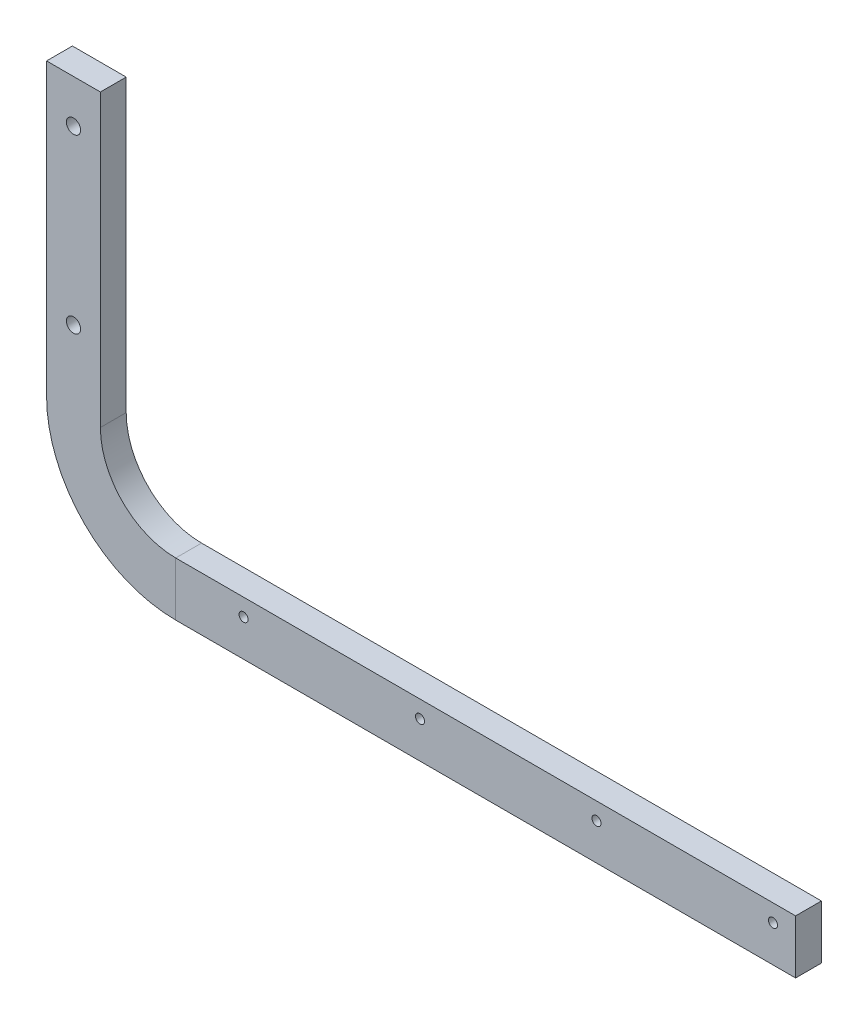
ISO-10303-21;
HEADER;
FILE_DESCRIPTION(('STEP AP214'),'2;1');
FILE_NAME('part.step','',(''),(''),'','','');
FILE_SCHEMA(('AUTOMOTIVE_DESIGN { 1 0 10303 214 1 1 1 1 }'));
ENDSEC;
DATA;
#1=APPLICATION_CONTEXT('core data for automotive mechanical design processes');
#2=APPLICATION_PROTOCOL_DEFINITION('international standard','automotive_design',2000,#1);
#3=PRODUCT_CONTEXT('',#1,'mechanical');
#4=PRODUCT('Part','Part','',(#3));
#5=PRODUCT_RELATED_PRODUCT_CATEGORY('part','',(#4));
#6=PRODUCT_DEFINITION_FORMATION('','',#4);
#7=PRODUCT_DEFINITION_CONTEXT('part definition',#1,'design');
#8=PRODUCT_DEFINITION('design','',#6,#7);
#9=PRODUCT_DEFINITION_SHAPE('','',#8);
#10=(LENGTH_UNIT() NAMED_UNIT(*) SI_UNIT(.MILLI.,.METRE.));
#11=(NAMED_UNIT(*) PLANE_ANGLE_UNIT() SI_UNIT($,.RADIAN.));
#12=(NAMED_UNIT(*) SI_UNIT($,.STERADIAN.) SOLID_ANGLE_UNIT());
#13=UNCERTAINTY_MEASURE_WITH_UNIT(LENGTH_MEASURE(1.E-05),#10,'distance_accuracy_value','');
#14=(GEOMETRIC_REPRESENTATION_CONTEXT(3) GLOBAL_UNCERTAINTY_ASSIGNED_CONTEXT((#13)) GLOBAL_UNIT_ASSIGNED_CONTEXT((#10,
#11,#12)) REPRESENTATION_CONTEXT('',''));
#15=CARTESIAN_POINT('',(0.,0.,0.));
#16=DIRECTION('',(0.,0.,1.));
#17=DIRECTION('',(1.,0.,0.));
#18=AXIS2_PLACEMENT_3D('',#15,#16,#17);
#19=CARTESIAN_POINT('',(91.4999999999995,-178.,6.));
#20=DIRECTION('',(0.,0.,1.));
#21=DIRECTION('',(1.,0.,0.));
#22=AXIS2_PLACEMENT_3D('',#19,#20,#21);
#23=CYLINDRICAL_SURFACE('',#22,2.09999999999999);
#24=CARTESIAN_POINT('',(91.4999999999995,-178.,-6.));
#25=DIRECTION('',(0.,0.,1.));
#26=DIRECTION('',(1.,0.,0.));
#27=AXIS2_PLACEMENT_3D('',#24,#25,#26);
#28=CIRCLE('',#27,2.09999999999999);
#29=CARTESIAN_POINT('',(93.5999999999995,-178.,-6.));
#30=VERTEX_POINT('',#29);
#31=EDGE_CURVE('E51',#30,#30,#28,.T.);
#32=ORIENTED_EDGE('',*,*,#31,.F.);
#33=EDGE_LOOP('',(#32));
#34=FACE_BOUND('',#33,.T.);
#35=CARTESIAN_POINT('',(91.4999999999995,-178.,6.));
#36=DIRECTION('',(0.,0.,1.));
#37=DIRECTION('',(1.,0.,0.));
#38=AXIS2_PLACEMENT_3D('',#35,#36,#37);
#39=CIRCLE('',#38,2.09999999999999);
#40=CARTESIAN_POINT('',(93.5999999999995,-178.,6.));
#41=VERTEX_POINT('',#40);
#42=EDGE_CURVE('E11',#41,#41,#39,.T.);
#43=ORIENTED_EDGE('',*,*,#42,.T.);
#44=EDGE_LOOP('',(#43));
#45=FACE_BOUND('',#44,.T.);
#46=ADVANCED_FACE('F44',(#34,#45),#23,.F.);
#47=CARTESIAN_POINT('',(173.499999999999,-178.,6.));
#48=DIRECTION('',(0.,0.,1.));
#49=DIRECTION('',(1.,0.,0.));
#50=AXIS2_PLACEMENT_3D('',#47,#48,#49);
#51=CYLINDRICAL_SURFACE('',#50,2.09999999999999);
#52=CARTESIAN_POINT('',(173.499999999999,-178.,-6.));
#53=DIRECTION('',(0.,0.,1.));
#54=DIRECTION('',(1.,0.,0.));
#55=AXIS2_PLACEMENT_3D('',#52,#53,#54);
#56=CIRCLE('',#55,2.09999999999999);
#57=CARTESIAN_POINT('',(175.599999999999,-178.,-6.));
#58=VERTEX_POINT('',#57);
#59=EDGE_CURVE('E149',#58,#58,#56,.T.);
#60=ORIENTED_EDGE('',*,*,#59,.F.);
#61=EDGE_LOOP('',(#60));
#62=FACE_BOUND('',#61,.T.);
#63=CARTESIAN_POINT('',(173.499999999999,-178.,6.));
#64=DIRECTION('',(0.,0.,1.));
#65=DIRECTION('',(1.,0.,0.));
#66=AXIS2_PLACEMENT_3D('',#63,#64,#65);
#67=CIRCLE('',#66,2.09999999999999);
#68=CARTESIAN_POINT('',(175.599999999999,-178.,6.));
#69=VERTEX_POINT('',#68);
#70=EDGE_CURVE('E152',#69,#69,#67,.T.);
#71=ORIENTED_EDGE('',*,*,#70,.T.);
#72=EDGE_LOOP('',(#71));
#73=FACE_BOUND('',#72,.T.);
#74=ADVANCED_FACE('F161',(#62,#73),#51,.F.);
#75=CARTESIAN_POINT('',(60.,-135.,6.));
#76=DIRECTION('',(0.,0.,1.));
#77=DIRECTION('',(1.,0.,0.));
#78=AXIS2_PLACEMENT_3D('',#75,#76,#77);
#79=PLANE('',#78);
#80=CARTESIAN_POINT('',(12.5,-20.0000000000001,6.));
#81=DIRECTION('',(0.,0.,1.));
#82=DIRECTION('',(1.,0.,0.));
#83=AXIS2_PLACEMENT_3D('',#80,#81,#82);
#84=CIRCLE('',#83,3.3);
#85=CARTESIAN_POINT('',(15.8,-20.0000000000001,6.));
#86=VERTEX_POINT('',#85);
#87=EDGE_CURVE('E194',#86,#86,#84,.T.);
#88=ORIENTED_EDGE('',*,*,#87,.F.);
#89=EDGE_LOOP('',(#88));
#90=FACE_BOUND('',#89,.T.);
#91=CARTESIAN_POINT('',(12.4999999999993,-100.,6.));
#92=DIRECTION('',(0.,0.,1.));
#93=DIRECTION('',(1.,0.,0.));
#94=AXIS2_PLACEMENT_3D('',#91,#92,#93);
#95=CIRCLE('',#94,3.3);
#96=CARTESIAN_POINT('',(15.7999999999993,-100.,6.));
#97=VERTEX_POINT('',#96);
#98=EDGE_CURVE('E197',#97,#97,#95,.T.);
#99=ORIENTED_EDGE('',*,*,#98,.F.);
#100=EDGE_LOOP('',(#99));
#101=FACE_BOUND('',#100,.T.);
#102=CARTESIAN_POINT('',(60.,-135.,6.));
#103=DIRECTION('',(0.,0.,1.));
#104=DIRECTION('',(1.,0.,0.));
#105=AXIS2_PLACEMENT_3D('',#102,#103,#104);
#106=CIRCLE('',#105,60.);
#107=CARTESIAN_POINT('',(0.,-135.,6.));
#108=VERTEX_POINT('',#107);
#109=CARTESIAN_POINT('',(60.,-195.,6.));
#110=VERTEX_POINT('',#109);
#111=EDGE_CURVE('E124',#108,#110,#106,.T.);
#112=ORIENTED_EDGE('',*,*,#111,.T.);
#113=DIRECTION('',(0.,1.,0.));
#114=VECTOR('',#113,1.);
#115=CARTESIAN_POINT('',(60.,-135.,6.));
#116=LINE('',#115,#114);
#117=CARTESIAN_POINT('',(60.,-170.,6.));
#118=VERTEX_POINT('',#117);
#119=EDGE_CURVE('E141',#110,#118,#116,.T.);
#120=ORIENTED_EDGE('',*,*,#119,.T.);
#121=CARTESIAN_POINT('',(60.,-135.,6.));
#122=DIRECTION('',(0.,0.,-1.));
#123=DIRECTION('',(-1.,0.,0.));
#124=AXIS2_PLACEMENT_3D('',#121,#122,#123);
#125=CIRCLE('',#124,35.);
#126=CARTESIAN_POINT('',(25.,-135.,6.));
#127=VERTEX_POINT('',#126);
#128=EDGE_CURVE('E216',#118,#127,#125,.T.);
#129=ORIENTED_EDGE('',*,*,#128,.T.);
#130=DIRECTION('',(0.,1.,0.));
#131=VECTOR('',#130,1.);
#132=CARTESIAN_POINT('',(25.,-135.,6.));
#133=LINE('',#132,#131);
#134=CARTESIAN_POINT('',(25.,0.,6.));
#135=VERTEX_POINT('',#134);
#136=EDGE_CURVE('E130',#127,#135,#133,.T.);
#137=ORIENTED_EDGE('',*,*,#136,.T.);
#138=DIRECTION('',(-1.,0.,0.));
#139=VECTOR('',#138,1.);
#140=CARTESIAN_POINT('',(25.,0.,6.));
#141=LINE('',#140,#139);
#142=CARTESIAN_POINT('',(0.,0.,6.));
#143=VERTEX_POINT('',#142);
#144=EDGE_CURVE('E125',#135,#143,#141,.T.);
#145=ORIENTED_EDGE('',*,*,#144,.T.);
#146=DIRECTION('',(0.,-1.,0.));
#147=VECTOR('',#146,1.);
#148=CARTESIAN_POINT('',(0.,0.,6.));
#149=LINE('',#148,#147);
#150=EDGE_CURVE('E112',#143,#108,#149,.T.);
#151=ORIENTED_EDGE('',*,*,#150,.T.);
#152=EDGE_LOOP('',(#112,#120,#129,#137,#145,#151));
#153=FACE_BOUND('',#152,.T.);
#154=ADVANCED_FACE('F128',(#90,#101,#153),#79,.T.);
#155=CARTESIAN_POINT('',(60.,-135.,-6.));
#156=DIRECTION('',(0.,0.,1.));
#157=DIRECTION('',(1.,0.,0.));
#158=AXIS2_PLACEMENT_3D('',#155,#156,#157);
#159=PLANE('',#158);
#160=CARTESIAN_POINT('',(255.499999999999,-178.,-6.));
#161=DIRECTION('',(0.,0.,1.));
#162=DIRECTION('',(1.,0.,0.));
#163=AXIS2_PLACEMENT_3D('',#160,#161,#162);
#164=CIRCLE('',#163,2.09999999999999);
#165=CARTESIAN_POINT('',(257.599999999999,-178.,-6.));
#166=VERTEX_POINT('',#165);
#167=EDGE_CURVE('E507',#166,#166,#164,.T.);
#168=ORIENTED_EDGE('',*,*,#167,.T.);
#169=EDGE_LOOP('',(#168));
#170=FACE_BOUND('',#169,.T.);
#171=CARTESIAN_POINT('',(337.499999999999,-178.,-6.));
#172=DIRECTION('',(0.,0.,1.));
#173=DIRECTION('',(1.,0.,0.));
#174=AXIS2_PLACEMENT_3D('',#171,#172,#173);
#175=CIRCLE('',#174,2.09999999999999);
#176=CARTESIAN_POINT('',(339.599999999999,-178.,-6.));
#177=VERTEX_POINT('',#176);
#178=EDGE_CURVE('E513',#177,#177,#175,.T.);
#179=ORIENTED_EDGE('',*,*,#178,.T.);
#180=EDGE_LOOP('',(#179));
#181=FACE_BOUND('',#180,.T.);
#182=DIRECTION('',(-1.,0.,0.));
#183=VECTOR('',#182,1.);
#184=CARTESIAN_POINT('',(60.,-116.604888099516,-6.));
#185=LINE('',#184,#183);
#186=CARTESIAN_POINT('',(25.,-116.604888099516,-6.));
#187=VERTEX_POINT('',#186);
#188=CARTESIAN_POINT('',(0.,-116.604888099516,-6.));
#189=VERTEX_POINT('',#188);
#190=EDGE_CURVE('E58',#187,#189,#185,.T.);
#191=ORIENTED_EDGE('',*,*,#190,.F.);
#192=DIRECTION('',(0.,1.,0.));
#193=VECTOR('',#192,1.);
#194=CARTESIAN_POINT('',(25.,-135.,-6.));
#195=LINE('',#194,#193);
#196=CARTESIAN_POINT('',(25.,-135.,-6.));
#197=VERTEX_POINT('',#196);
#198=EDGE_CURVE('E134',#197,#187,#195,.T.);
#199=ORIENTED_EDGE('',*,*,#198,.F.);
#200=CARTESIAN_POINT('',(60.,-135.,-6.));
#201=DIRECTION('',(0.,0.,-1.));
#202=DIRECTION('',(-1.,0.,0.));
#203=AXIS2_PLACEMENT_3D('',#200,#201,#202);
#204=CIRCLE('',#203,35.);
#205=CARTESIAN_POINT('',(60.,-170.,-6.));
#206=VERTEX_POINT('',#205);
#207=EDGE_CURVE('E232',#206,#197,#204,.T.);
#208=ORIENTED_EDGE('',*,*,#207,.F.);
#209=DIRECTION('',(-1.,0.,0.));
#210=VECTOR('',#209,1.);
#211=CARTESIAN_POINT('',(348.,-170.,-6.));
#212=LINE('',#211,#210);
#213=CARTESIAN_POINT('',(348.,-170.,-6.));
#214=VERTEX_POINT('',#213);
#215=EDGE_CURVE('E230',#214,#206,#212,.T.);
#216=ORIENTED_EDGE('',*,*,#215,.F.);
#217=DIRECTION('',(0.,1.,0.));
#218=VECTOR('',#217,1.);
#219=CARTESIAN_POINT('',(348.,-195.,-6.));
#220=LINE('',#219,#218);
#221=CARTESIAN_POINT('',(348.,-195.,-6.));
#222=VERTEX_POINT('',#221);
#223=EDGE_CURVE('E228',#222,#214,#220,.T.);
#224=ORIENTED_EDGE('',*,*,#223,.F.);
#225=DIRECTION('',(1.,0.,0.));
#226=VECTOR('',#225,1.);
#227=CARTESIAN_POINT('',(60.,-195.,-6.));
#228=LINE('',#227,#226);
#229=CARTESIAN_POINT('',(60.,-195.,-6.));
#230=VERTEX_POINT('',#229);
#231=EDGE_CURVE('E226',#230,#222,#228,.T.);
#232=ORIENTED_EDGE('',*,*,#231,.F.);
#233=CARTESIAN_POINT('',(60.,-135.,-6.));
#234=DIRECTION('',(0.,0.,1.));
#235=DIRECTION('',(1.,0.,0.));
#236=AXIS2_PLACEMENT_3D('',#233,#234,#235);
#237=CIRCLE('',#236,60.);
#238=CARTESIAN_POINT('',(0.,-135.,-6.));
#239=VERTEX_POINT('',#238);
#240=EDGE_CURVE('E224',#239,#230,#237,.T.);
#241=ORIENTED_EDGE('',*,*,#240,.F.);
#242=DIRECTION('',(0.,-1.,0.));
#243=VECTOR('',#242,1.);
#244=CARTESIAN_POINT('',(0.,0.,-6.));
#245=LINE('',#244,#243);
#246=EDGE_CURVE('E221',#189,#239,#245,.T.);
#247=ORIENTED_EDGE('',*,*,#246,.F.);
#248=EDGE_LOOP('',(#191,#199,#208,#216,#224,#232,#241,#247));
#249=FACE_BOUND('',#248,.T.);
#250=ORIENTED_EDGE('',*,*,#59,.T.);
#251=EDGE_LOOP('',(#250));
#252=FACE_BOUND('',#251,.T.);
#253=ORIENTED_EDGE('',*,*,#31,.T.);
#254=EDGE_LOOP('',(#253));
#255=FACE_BOUND('',#254,.T.);
#256=ADVANCED_FACE('F157',(#170,#181,#249,#252,#255),#159,.F.);
#257=CARTESIAN_POINT('',(25.,0.,6.));
#258=DIRECTION('',(0.,-1.,0.));
#259=DIRECTION('',(1.,0.,0.));
#260=AXIS2_PLACEMENT_3D('',#257,#258,#259);
#261=PLANE('',#260);
#262=DIRECTION('',(-1.,0.,0.));
#263=VECTOR('',#262,1.);
#264=CARTESIAN_POINT('',(25.,0.,-6.));
#265=LINE('',#264,#263);
#266=CARTESIAN_POINT('',(25.,0.,-6.));
#267=VERTEX_POINT('',#266);
#268=CARTESIAN_POINT('',(0.,0.,-6.));
#269=VERTEX_POINT('',#268);
#270=EDGE_CURVE('E138',#267,#269,#265,.T.);
#271=ORIENTED_EDGE('',*,*,#270,.T.);
#272=DIRECTION('',(0.,0.,-1.));
#273=VECTOR('',#272,1.);
#274=CARTESIAN_POINT('',(0.,0.,6.));
#275=LINE('',#274,#273);
#276=EDGE_CURVE('E117',#143,#269,#275,.T.);
#277=ORIENTED_EDGE('',*,*,#276,.F.);
#278=ORIENTED_EDGE('',*,*,#144,.F.);
#279=DIRECTION('',(0.,0.,-1.));
#280=VECTOR('',#279,1.);
#281=CARTESIAN_POINT('',(25.,0.,6.));
#282=LINE('',#281,#280);
#283=EDGE_CURVE('E219',#135,#267,#282,.T.);
#284=ORIENTED_EDGE('',*,*,#283,.T.);
#285=EDGE_LOOP('',(#271,#277,#278,#284));
#286=FACE_BOUND('',#285,.T.);
#287=ADVANCED_FACE('F136',(#286),#261,.F.);
#288=CARTESIAN_POINT('',(0.,0.,6.));
#289=DIRECTION('',(1.,0.,0.));
#290=DIRECTION('',(0.,1.,0.));
#291=AXIS2_PLACEMENT_3D('',#288,#289,#290);
#292=PLANE('',#291);
#293=EDGE_CURVE('E222',#269,#189,#245,.T.);
#294=ORIENTED_EDGE('',*,*,#293,.T.);
#295=ORIENTED_EDGE('',*,*,#246,.T.);
#296=DIRECTION('',(0.,0.,-1.));
#297=VECTOR('',#296,1.);
#298=CARTESIAN_POINT('',(0.,-135.,6.));
#299=LINE('',#298,#297);
#300=EDGE_CURVE('E120',#108,#239,#299,.T.);
#301=ORIENTED_EDGE('',*,*,#300,.F.);
#302=ORIENTED_EDGE('',*,*,#150,.F.);
#303=ORIENTED_EDGE('',*,*,#276,.T.);
#304=EDGE_LOOP('',(#294,#295,#301,#302,#303));
#305=FACE_BOUND('',#304,.T.);
#306=ADVANCED_FACE('F115',(#305),#292,.F.);
#307=CARTESIAN_POINT('',(60.,-135.,6.));
#308=DIRECTION('',(0.,0.,-1.));
#309=DIRECTION('',(-1.,0.,0.));
#310=AXIS2_PLACEMENT_3D('',#307,#308,#309);
#311=CYLINDRICAL_SURFACE('',#310,60.);
#312=ORIENTED_EDGE('',*,*,#240,.T.);
#313=DIRECTION('',(0.,0.,-1.));
#314=VECTOR('',#313,1.);
#315=CARTESIAN_POINT('',(60.,-195.,6.));
#316=LINE('',#315,#314);
#317=EDGE_CURVE('E143',#110,#230,#316,.T.);
#318=ORIENTED_EDGE('',*,*,#317,.F.);
#319=ORIENTED_EDGE('',*,*,#111,.F.);
#320=ORIENTED_EDGE('',*,*,#300,.T.);
#321=EDGE_LOOP('',(#312,#318,#319,#320));
#322=FACE_BOUND('',#321,.T.);
#323=ADVANCED_FACE('F273',(#322),#311,.T.);
#324=CARTESIAN_POINT('',(60.,-195.,6.));
#325=DIRECTION('',(0.,1.,0.));
#326=DIRECTION('',(0.,0.,1.));
#327=AXIS2_PLACEMENT_3D('',#324,#325,#326);
#328=PLANE('',#327);
#329=ORIENTED_EDGE('',*,*,#231,.T.);
#330=DIRECTION('',(0.,0.,-1.));
#331=VECTOR('',#330,1.);
#332=CARTESIAN_POINT('',(348.,-195.,6.));
#333=LINE('',#332,#331);
#334=CARTESIAN_POINT('',(348.,-195.,6.));
#335=VERTEX_POINT('',#334);
#336=EDGE_CURVE('E247',#335,#222,#333,.T.);
#337=ORIENTED_EDGE('',*,*,#336,.F.);
#338=DIRECTION('',(1.,0.,0.));
#339=VECTOR('',#338,1.);
#340=CARTESIAN_POINT('',(60.,-195.,6.));
#341=LINE('',#340,#339);
#342=EDGE_CURVE('E209',#110,#335,#341,.T.);
#343=ORIENTED_EDGE('',*,*,#342,.F.);
#344=ORIENTED_EDGE('',*,*,#317,.T.);
#345=EDGE_LOOP('',(#329,#337,#343,#344));
#346=FACE_BOUND('',#345,.T.);
#347=ADVANCED_FACE('F254',(#346),#328,.F.);
#348=CARTESIAN_POINT('',(348.,-195.,6.));
#349=DIRECTION('',(-1.,0.,0.));
#350=DIRECTION('',(0.,0.,1.));
#351=AXIS2_PLACEMENT_3D('',#348,#349,#350);
#352=PLANE('',#351);
#353=ORIENTED_EDGE('',*,*,#223,.T.);
#354=DIRECTION('',(0.,0.,-1.));
#355=VECTOR('',#354,1.);
#356=CARTESIAN_POINT('',(348.,-170.,6.));
#357=LINE('',#356,#355);
#358=CARTESIAN_POINT('',(348.,-170.,6.));
#359=VERTEX_POINT('',#358);
#360=EDGE_CURVE('E244',#359,#214,#357,.T.);
#361=ORIENTED_EDGE('',*,*,#360,.F.);
#362=DIRECTION('',(0.,1.,0.));
#363=VECTOR('',#362,1.);
#364=CARTESIAN_POINT('',(348.,-195.,6.));
#365=LINE('',#364,#363);
#366=EDGE_CURVE('E211',#335,#359,#365,.T.);
#367=ORIENTED_EDGE('',*,*,#366,.F.);
#368=ORIENTED_EDGE('',*,*,#336,.T.);
#369=EDGE_LOOP('',(#353,#361,#367,#368));
#370=FACE_BOUND('',#369,.T.);
#371=ADVANCED_FACE('F264',(#370),#352,.F.);
#372=CARTESIAN_POINT('',(348.,-170.,6.));
#373=DIRECTION('',(0.,-1.,0.));
#374=DIRECTION('',(1.,0.,0.));
#375=AXIS2_PLACEMENT_3D('',#372,#373,#374);
#376=PLANE('',#375);
#377=ORIENTED_EDGE('',*,*,#215,.T.);
#378=DIRECTION('',(0.,0.,-1.));
#379=VECTOR('',#378,1.);
#380=CARTESIAN_POINT('',(60.,-170.,6.));
#381=LINE('',#380,#379);
#382=EDGE_CURVE('E241',#118,#206,#381,.T.);
#383=ORIENTED_EDGE('',*,*,#382,.F.);
#384=DIRECTION('',(-1.,0.,0.));
#385=VECTOR('',#384,1.);
#386=CARTESIAN_POINT('',(348.,-170.,6.));
#387=LINE('',#386,#385);
#388=EDGE_CURVE('E213',#359,#118,#387,.T.);
#389=ORIENTED_EDGE('',*,*,#388,.F.);
#390=ORIENTED_EDGE('',*,*,#360,.T.);
#391=EDGE_LOOP('',(#377,#383,#389,#390));
#392=FACE_BOUND('',#391,.T.);
#393=ADVANCED_FACE('F268',(#392),#376,.F.);
#394=CARTESIAN_POINT('',(60.,-135.,6.));
#395=DIRECTION('',(0.,0.,-1.));
#396=DIRECTION('',(-1.,0.,0.));
#397=AXIS2_PLACEMENT_3D('',#394,#395,#396);
#398=CYLINDRICAL_SURFACE('',#397,35.);
#399=ORIENTED_EDGE('',*,*,#207,.T.);
#400=DIRECTION('',(0.,0.,-1.));
#401=VECTOR('',#400,1.);
#402=CARTESIAN_POINT('',(25.,-135.,6.));
#403=LINE('',#402,#401);
#404=EDGE_CURVE('E238',#127,#197,#403,.T.);
#405=ORIENTED_EDGE('',*,*,#404,.F.);
#406=ORIENTED_EDGE('',*,*,#128,.F.);
#407=ORIENTED_EDGE('',*,*,#382,.T.);
#408=EDGE_LOOP('',(#399,#405,#406,#407));
#409=FACE_BOUND('',#408,.T.);
#410=ADVANCED_FACE('F177',(#409),#398,.F.);
#411=CARTESIAN_POINT('',(25.,-135.,6.));
#412=DIRECTION('',(-1.,0.,0.));
#413=DIRECTION('',(0.,0.,1.));
#414=AXIS2_PLACEMENT_3D('',#411,#412,#413);
#415=PLANE('',#414);
#416=ORIENTED_EDGE('',*,*,#198,.T.);
#417=EDGE_CURVE('E234',#187,#267,#195,.T.);
#418=ORIENTED_EDGE('',*,*,#417,.T.);
#419=ORIENTED_EDGE('',*,*,#283,.F.);
#420=ORIENTED_EDGE('',*,*,#136,.F.);
#421=ORIENTED_EDGE('',*,*,#404,.T.);
#422=EDGE_LOOP('',(#416,#418,#419,#420,#421));
#423=FACE_BOUND('',#422,.T.);
#424=ADVANCED_FACE('F167',(#423),#415,.F.);
#425=CARTESIAN_POINT('',(255.499999999999,-178.,6.));
#426=DIRECTION('',(0.,0.,1.));
#427=DIRECTION('',(1.,0.,0.));
#428=AXIS2_PLACEMENT_3D('',#425,#426,#427);
#429=CIRCLE('',#428,2.09999999999999);
#430=CARTESIAN_POINT('',(257.599999999999,-178.,6.));
#431=VERTEX_POINT('',#430);
#432=EDGE_CURVE('E509',#431,#431,#429,.T.);
#433=ORIENTED_EDGE('',*,*,#432,.F.);
#434=EDGE_LOOP('',(#433));
#435=FACE_BOUND('',#434,.T.);
#436=CARTESIAN_POINT('',(337.499999999999,-178.,6.));
#437=DIRECTION('',(0.,0.,1.));
#438=DIRECTION('',(1.,0.,0.));
#439=AXIS2_PLACEMENT_3D('',#436,#437,#438);
#440=CIRCLE('',#439,2.09999999999999);
#441=CARTESIAN_POINT('',(339.599999999999,-178.,6.));
#442=VERTEX_POINT('',#441);
#443=EDGE_CURVE('E510',#442,#442,#440,.T.);
#444=ORIENTED_EDGE('',*,*,#443,.F.);
#445=EDGE_LOOP('',(#444));
#446=FACE_BOUND('',#445,.T.);
#447=ORIENTED_EDGE('',*,*,#119,.F.);
#448=ORIENTED_EDGE('',*,*,#342,.T.);
#449=ORIENTED_EDGE('',*,*,#366,.T.);
#450=ORIENTED_EDGE('',*,*,#388,.T.);
#451=EDGE_LOOP('',(#447,#448,#449,#450));
#452=FACE_BOUND('',#451,.T.);
#453=ORIENTED_EDGE('',*,*,#70,.F.);
#454=EDGE_LOOP('',(#453));
#455=FACE_BOUND('',#454,.T.);
#456=ORIENTED_EDGE('',*,*,#42,.F.);
#457=EDGE_LOOP('',(#456));
#458=FACE_BOUND('',#457,.T.);
#459=ADVANCED_FACE('F164',(#435,#446,#452,#455,#458),#79,.T.);
#460=CARTESIAN_POINT('',(12.5,-20.0000000000001,-6.));
#461=DIRECTION('',(0.,0.,1.));
#462=DIRECTION('',(1.,0.,0.));
#463=AXIS2_PLACEMENT_3D('',#460,#461,#462);
#464=CIRCLE('',#463,3.3);
#465=CARTESIAN_POINT('',(15.8,-20.0000000000001,-6.));
#466=VERTEX_POINT('',#465);
#467=EDGE_CURVE('E200',#466,#466,#464,.T.);
#468=ORIENTED_EDGE('',*,*,#467,.T.);
#469=EDGE_LOOP('',(#468));
#470=FACE_BOUND('',#469,.T.);
#471=CARTESIAN_POINT('',(12.4999999999993,-100.,-6.));
#472=DIRECTION('',(0.,0.,1.));
#473=DIRECTION('',(1.,0.,0.));
#474=AXIS2_PLACEMENT_3D('',#471,#472,#473);
#475=CIRCLE('',#474,3.3);
#476=CARTESIAN_POINT('',(15.7999999999993,-100.,-6.));
#477=VERTEX_POINT('',#476);
#478=EDGE_CURVE('E199',#477,#477,#475,.T.);
#479=ORIENTED_EDGE('',*,*,#478,.T.);
#480=EDGE_LOOP('',(#479));
#481=FACE_BOUND('',#480,.T.);
#482=ORIENTED_EDGE('',*,*,#417,.F.);
#483=ORIENTED_EDGE('',*,*,#190,.T.);
#484=ORIENTED_EDGE('',*,*,#293,.F.);
#485=ORIENTED_EDGE('',*,*,#270,.F.);
#486=EDGE_LOOP('',(#482,#483,#484,#485));
#487=FACE_BOUND('',#486,.T.);
#488=ADVANCED_FACE('F166',(#470,#481,#487),#159,.F.);
#489=CARTESIAN_POINT('',(12.4999999999993,-100.,6.));
#490=DIRECTION('',(0.,0.,1.));
#491=DIRECTION('',(1.,0.,0.));
#492=AXIS2_PLACEMENT_3D('',#489,#490,#491);
#493=CYLINDRICAL_SURFACE('',#492,3.3);
#494=ORIENTED_EDGE('',*,*,#478,.F.);
#495=EDGE_LOOP('',(#494));
#496=FACE_BOUND('',#495,.T.);
#497=ORIENTED_EDGE('',*,*,#98,.T.);
#498=EDGE_LOOP('',(#497));
#499=FACE_BOUND('',#498,.T.);
#500=ADVANCED_FACE('F174',(#496,#499),#493,.F.);
#501=CARTESIAN_POINT('',(12.5,-20.0000000000001,6.));
#502=DIRECTION('',(0.,0.,1.));
#503=DIRECTION('',(1.,0.,0.));
#504=AXIS2_PLACEMENT_3D('',#501,#502,#503);
#505=CYLINDRICAL_SURFACE('',#504,3.3);
#506=ORIENTED_EDGE('',*,*,#467,.F.);
#507=EDGE_LOOP('',(#506));
#508=FACE_BOUND('',#507,.T.);
#509=ORIENTED_EDGE('',*,*,#87,.T.);
#510=EDGE_LOOP('',(#509));
#511=FACE_BOUND('',#510,.T.);
#512=ADVANCED_FACE('F356',(#508,#511),#505,.F.);
#513=CARTESIAN_POINT('',(337.499999999999,-178.,6.));
#514=DIRECTION('',(0.,0.,1.));
#515=DIRECTION('',(1.,0.,0.));
#516=AXIS2_PLACEMENT_3D('',#513,#514,#515);
#517=CYLINDRICAL_SURFACE('',#516,2.09999999999999);
#518=ORIENTED_EDGE('',*,*,#178,.F.);
#519=EDGE_LOOP('',(#518));
#520=FACE_BOUND('',#519,.T.);
#521=ORIENTED_EDGE('',*,*,#443,.T.);
#522=EDGE_LOOP('',(#521));
#523=FACE_BOUND('',#522,.T.);
#524=ADVANCED_FACE('F364',(#520,#523),#517,.F.);
#525=CARTESIAN_POINT('',(255.499999999999,-178.,6.));
#526=DIRECTION('',(0.,0.,1.));
#527=DIRECTION('',(1.,0.,0.));
#528=AXIS2_PLACEMENT_3D('',#525,#526,#527);
#529=CYLINDRICAL_SURFACE('',#528,2.09999999999999);
#530=ORIENTED_EDGE('',*,*,#167,.F.);
#531=EDGE_LOOP('',(#530));
#532=FACE_BOUND('',#531,.T.);
#533=ORIENTED_EDGE('',*,*,#432,.T.);
#534=EDGE_LOOP('',(#533));
#535=FACE_BOUND('',#534,.T.);
#536=ADVANCED_FACE('F374',(#532,#535),#529,.F.);
#537=CLOSED_SHELL('',(#46,#74,#154,#256,#287,#306,#323,#347,#371,#393,#410,#424,#459,#488,#500,
#512,#524,#536));
#538=MANIFOLD_SOLID_BREP('B2',#537);
#539=ADVANCED_BREP_SHAPE_REPRESENTATION('',(#18,#538),#14);
#540=SHAPE_DEFINITION_REPRESENTATION(#9,#539);
ENDSEC;
END-ISO-10303-21;
